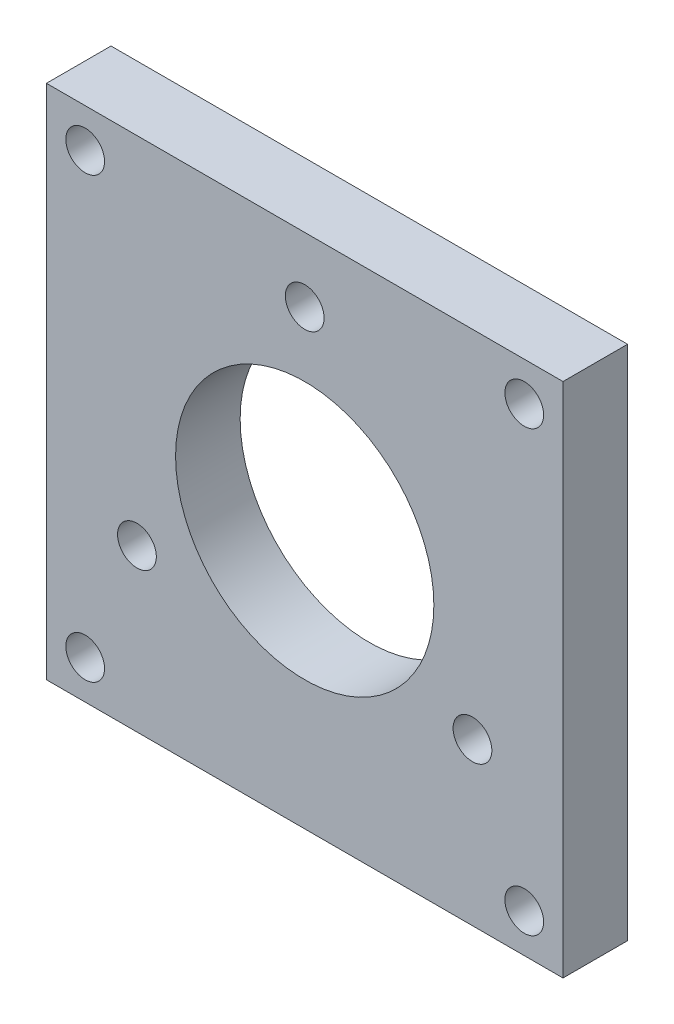
ISO-10303-21;
HEADER;
FILE_DESCRIPTION(('STEP AP214'),'2;1');
FILE_NAME('part.step','',(''),(''),'','','');
FILE_SCHEMA(('AUTOMOTIVE_DESIGN { 1 0 10303 214 1 1 1 1 }'));
ENDSEC;
DATA;
#1=APPLICATION_CONTEXT('core data for automotive mechanical design processes');
#2=APPLICATION_PROTOCOL_DEFINITION('international standard','automotive_design',2000,#1);
#3=PRODUCT_CONTEXT('',#1,'mechanical');
#4=PRODUCT('Part','Part','',(#3));
#5=PRODUCT_RELATED_PRODUCT_CATEGORY('part','',(#4));
#6=PRODUCT_DEFINITION_FORMATION('','',#4);
#7=PRODUCT_DEFINITION_CONTEXT('part definition',#1,'design');
#8=PRODUCT_DEFINITION('design','',#6,#7);
#9=PRODUCT_DEFINITION_SHAPE('','',#8);
#10=(LENGTH_UNIT() NAMED_UNIT(*) SI_UNIT(.MILLI.,.METRE.));
#11=(NAMED_UNIT(*) PLANE_ANGLE_UNIT() SI_UNIT($,.RADIAN.));
#12=(NAMED_UNIT(*) SI_UNIT($,.STERADIAN.) SOLID_ANGLE_UNIT());
#13=UNCERTAINTY_MEASURE_WITH_UNIT(LENGTH_MEASURE(1.E-05),#10,'distance_accuracy_value','');
#14=(GEOMETRIC_REPRESENTATION_CONTEXT(3) GLOBAL_UNCERTAINTY_ASSIGNED_CONTEXT((#13)) GLOBAL_UNIT_ASSIGNED_CONTEXT((#10,
#11,#12)) REPRESENTATION_CONTEXT('',''));
#15=CARTESIAN_POINT('',(0.,0.,0.));
#16=DIRECTION('',(0.,0.,1.));
#17=DIRECTION('',(1.,0.,0.));
#18=AXIS2_PLACEMENT_3D('',#15,#16,#17);
#19=CARTESIAN_POINT('',(20.,-20.,5.));
#20=DIRECTION('',(-1.,0.,0.));
#21=DIRECTION('',(0.,0.,1.));
#22=AXIS2_PLACEMENT_3D('',#19,#20,#21);
#23=PLANE('',#22);
#24=DIRECTION('',(0.,1.,0.));
#25=VECTOR('',#24,1.);
#26=CARTESIAN_POINT('',(20.,-20.,0.));
#27=LINE('',#26,#25);
#28=CARTESIAN_POINT('',(20.,-20.,0.));
#29=VERTEX_POINT('',#28);
#30=CARTESIAN_POINT('',(20.,20.,0.));
#31=VERTEX_POINT('',#30);
#32=EDGE_CURVE('E99',#29,#31,#27,.T.);
#33=ORIENTED_EDGE('',*,*,#32,.T.);
#34=DIRECTION('',(0.,0.,-1.));
#35=VECTOR('',#34,1.);
#36=CARTESIAN_POINT('',(20.,20.,5.));
#37=LINE('',#36,#35);
#38=CARTESIAN_POINT('',(20.,20.,5.));
#39=VERTEX_POINT('',#38);
#40=EDGE_CURVE('E11',#39,#31,#37,.T.);
#41=ORIENTED_EDGE('',*,*,#40,.F.);
#42=DIRECTION('',(0.,1.,0.));
#43=VECTOR('',#42,1.);
#44=CARTESIAN_POINT('',(20.,-20.,5.));
#45=LINE('',#44,#43);
#46=CARTESIAN_POINT('',(20.,-20.,5.));
#47=VERTEX_POINT('',#46);
#48=EDGE_CURVE('E87',#47,#39,#45,.T.);
#49=ORIENTED_EDGE('',*,*,#48,.F.);
#50=DIRECTION('',(0.,0.,-1.));
#51=VECTOR('',#50,1.);
#52=CARTESIAN_POINT('',(20.,-20.,5.));
#53=LINE('',#52,#51);
#54=EDGE_CURVE('E95',#47,#29,#53,.T.);
#55=ORIENTED_EDGE('',*,*,#54,.T.);
#56=EDGE_LOOP('',(#33,#41,#49,#55));
#57=FACE_BOUND('',#56,.T.);
#58=ADVANCED_FACE('F36',(#57),#23,.F.);
#59=CARTESIAN_POINT('',(-20.,20.,5.));
#60=DIRECTION('',(0.,-1.,0.));
#61=DIRECTION('',(1.,0.,0.));
#62=AXIS2_PLACEMENT_3D('',#59,#60,#61);
#63=PLANE('',#62);
#64=DIRECTION('',(-1.,0.,0.));
#65=VECTOR('',#64,1.);
#66=CARTESIAN_POINT('',(-20.,20.,0.));
#67=LINE('',#66,#65);
#68=CARTESIAN_POINT('',(-20.,20.,0.));
#69=VERTEX_POINT('',#68);
#70=EDGE_CURVE('E91',#31,#69,#67,.T.);
#71=ORIENTED_EDGE('',*,*,#70,.T.);
#72=DIRECTION('',(0.,0.,-1.));
#73=VECTOR('',#72,1.);
#74=CARTESIAN_POINT('',(-20.,20.,5.));
#75=LINE('',#74,#73);
#76=CARTESIAN_POINT('',(-20.,20.,5.));
#77=VERTEX_POINT('',#76);
#78=EDGE_CURVE('E44',#77,#69,#75,.T.);
#79=ORIENTED_EDGE('',*,*,#78,.F.);
#80=DIRECTION('',(-1.,0.,0.));
#81=VECTOR('',#80,1.);
#82=CARTESIAN_POINT('',(-20.,20.,5.));
#83=LINE('',#82,#81);
#84=EDGE_CURVE('E82',#39,#77,#83,.T.);
#85=ORIENTED_EDGE('',*,*,#84,.F.);
#86=ORIENTED_EDGE('',*,*,#40,.T.);
#87=EDGE_LOOP('',(#71,#79,#85,#86));
#88=FACE_BOUND('',#87,.T.);
#89=ADVANCED_FACE('F90',(#88),#63,.F.);
#90=CARTESIAN_POINT('',(-20.,-20.,5.));
#91=DIRECTION('',(1.,0.,0.));
#92=DIRECTION('',(0.,1.,0.));
#93=AXIS2_PLACEMENT_3D('',#90,#91,#92);
#94=PLANE('',#93);
#95=DIRECTION('',(0.,-1.,0.));
#96=VECTOR('',#95,1.);
#97=CARTESIAN_POINT('',(-20.,-20.,0.));
#98=LINE('',#97,#96);
#99=CARTESIAN_POINT('',(-20.,-20.,0.));
#100=VERTEX_POINT('',#99);
#101=EDGE_CURVE('E69',#69,#100,#98,.T.);
#102=ORIENTED_EDGE('',*,*,#101,.T.);
#103=DIRECTION('',(0.,0.,-1.));
#104=VECTOR('',#103,1.);
#105=CARTESIAN_POINT('',(-20.,-20.,5.));
#106=LINE('',#105,#104);
#107=CARTESIAN_POINT('',(-20.,-20.,5.));
#108=VERTEX_POINT('',#107);
#109=EDGE_CURVE('E92',#108,#100,#106,.T.);
#110=ORIENTED_EDGE('',*,*,#109,.F.);
#111=DIRECTION('',(0.,-1.,0.));
#112=VECTOR('',#111,1.);
#113=CARTESIAN_POINT('',(-20.,-20.,5.));
#114=LINE('',#113,#112);
#115=EDGE_CURVE('E85',#77,#108,#114,.T.);
#116=ORIENTED_EDGE('',*,*,#115,.F.);
#117=ORIENTED_EDGE('',*,*,#78,.T.);
#118=EDGE_LOOP('',(#102,#110,#116,#117));
#119=FACE_BOUND('',#118,.T.);
#120=ADVANCED_FACE('F93',(#119),#94,.F.);
#121=CARTESIAN_POINT('',(-20.,-20.,5.));
#122=DIRECTION('',(0.,1.,0.));
#123=DIRECTION('',(0.,0.,1.));
#124=AXIS2_PLACEMENT_3D('',#121,#122,#123);
#125=PLANE('',#124);
#126=DIRECTION('',(1.,0.,0.));
#127=VECTOR('',#126,1.);
#128=CARTESIAN_POINT('',(-20.,-20.,0.));
#129=LINE('',#128,#127);
#130=EDGE_CURVE('E75',#100,#29,#129,.T.);
#131=ORIENTED_EDGE('',*,*,#130,.T.);
#132=ORIENTED_EDGE('',*,*,#54,.F.);
#133=DIRECTION('',(1.,0.,0.));
#134=VECTOR('',#133,1.);
#135=CARTESIAN_POINT('',(-20.,-20.,5.));
#136=LINE('',#135,#134);
#137=EDGE_CURVE('E52',#108,#47,#136,.T.);
#138=ORIENTED_EDGE('',*,*,#137,.F.);
#139=ORIENTED_EDGE('',*,*,#109,.T.);
#140=EDGE_LOOP('',(#131,#132,#138,#139));
#141=FACE_BOUND('',#140,.T.);
#142=ADVANCED_FACE('F107',(#141),#125,.F.);
#143=CARTESIAN_POINT('',(0.,0.,5.));
#144=DIRECTION('',(0.,0.,-1.));
#145=DIRECTION('',(-1.,0.,0.));
#146=AXIS2_PLACEMENT_3D('',#143,#144,#145);
#147=PLANE('',#146);
#148=CARTESIAN_POINT('',(17.,-17.,5.));
#149=DIRECTION('',(0.,0.,-1.));
#150=DIRECTION('',(1.,0.,0.));
#151=AXIS2_PLACEMENT_3D('',#148,#149,#150);
#152=CIRCLE('',#151,1.5);
#153=CARTESIAN_POINT('',(18.5,-17.,5.));
#154=VERTEX_POINT('',#153);
#155=EDGE_CURVE('E143',#154,#154,#152,.T.);
#156=ORIENTED_EDGE('',*,*,#155,.T.);
#157=EDGE_LOOP('',(#156));
#158=FACE_BOUND('',#157,.T.);
#159=CARTESIAN_POINT('',(-17.,-17.,5.));
#160=DIRECTION('',(0.,0.,-1.));
#161=DIRECTION('',(-1.,0.,0.));
#162=AXIS2_PLACEMENT_3D('',#159,#160,#161);
#163=CIRCLE('',#162,1.5);
#164=CARTESIAN_POINT('',(-18.5,-17.,5.));
#165=VERTEX_POINT('',#164);
#166=EDGE_CURVE('E149',#165,#165,#163,.T.);
#167=ORIENTED_EDGE('',*,*,#166,.T.);
#168=EDGE_LOOP('',(#167));
#169=FACE_BOUND('',#168,.T.);
#170=CARTESIAN_POINT('',(-17.,17.,5.));
#171=DIRECTION('',(0.,0.,-1.));
#172=DIRECTION('',(1.,0.,0.));
#173=AXIS2_PLACEMENT_3D('',#170,#171,#172);
#174=CIRCLE('',#173,1.5);
#175=CARTESIAN_POINT('',(-15.5,17.,5.));
#176=VERTEX_POINT('',#175);
#177=EDGE_CURVE('E155',#176,#176,#174,.T.);
#178=ORIENTED_EDGE('',*,*,#177,.T.);
#179=EDGE_LOOP('',(#178));
#180=FACE_BOUND('',#179,.T.);
#181=CARTESIAN_POINT('',(17.,17.,5.));
#182=DIRECTION('',(0.,0.,-1.));
#183=DIRECTION('',(-1.,0.,0.));
#184=AXIS2_PLACEMENT_3D('',#181,#182,#183);
#185=CIRCLE('',#184,1.5);
#186=CARTESIAN_POINT('',(15.5,17.,5.));
#187=VERTEX_POINT('',#186);
#188=EDGE_CURVE('E123',#187,#187,#185,.T.);
#189=ORIENTED_EDGE('',*,*,#188,.T.);
#190=EDGE_LOOP('',(#189));
#191=FACE_BOUND('',#190,.T.);
#192=CARTESIAN_POINT('',(0.,15.,5.));
#193=DIRECTION('',(0.,0.,-1.));
#194=DIRECTION('',(-1.,0.,0.));
#195=AXIS2_PLACEMENT_3D('',#192,#193,#194);
#196=CIRCLE('',#195,1.5);
#197=CARTESIAN_POINT('',(-1.5,15.,5.));
#198=VERTEX_POINT('',#197);
#199=EDGE_CURVE('E116',#198,#198,#196,.T.);
#200=ORIENTED_EDGE('',*,*,#199,.T.);
#201=EDGE_LOOP('',(#200));
#202=FACE_BOUND('',#201,.T.);
#203=CARTESIAN_POINT('',(-12.9903810567672,-7.49999999999963,5.));
#204=DIRECTION('',(0.,0.,-1.));
#205=DIRECTION('',(-1.,0.,0.));
#206=AXIS2_PLACEMENT_3D('',#203,#204,#205);
#207=CIRCLE('',#206,1.50000000000057);
#208=CARTESIAN_POINT('',(-14.4903810567678,-7.49999999999963,5.));
#209=VERTEX_POINT('',#208);
#210=EDGE_CURVE('E126',#209,#209,#207,.T.);
#211=ORIENTED_EDGE('',*,*,#210,.T.);
#212=EDGE_LOOP('',(#211));
#213=FACE_BOUND('',#212,.T.);
#214=CARTESIAN_POINT('',(12.9903810567659,-7.50000000000036,5.));
#215=DIRECTION('',(0.,0.,-1.));
#216=DIRECTION('',(-1.,0.,0.));
#217=AXIS2_PLACEMENT_3D('',#214,#215,#216);
#218=CIRCLE('',#217,1.50000000000084);
#219=CARTESIAN_POINT('',(11.4903810567651,-7.50000000000036,5.));
#220=VERTEX_POINT('',#219);
#221=EDGE_CURVE('E119',#220,#220,#218,.T.);
#222=ORIENTED_EDGE('',*,*,#221,.T.);
#223=EDGE_LOOP('',(#222));
#224=FACE_BOUND('',#223,.T.);
#225=CARTESIAN_POINT('',(0.,0.,5.));
#226=DIRECTION('',(0.,0.,-1.));
#227=DIRECTION('',(-1.,0.,0.));
#228=AXIS2_PLACEMENT_3D('',#225,#226,#227);
#229=CIRCLE('',#228,10.);
#230=CARTESIAN_POINT('',(-10.,0.,5.));
#231=VERTEX_POINT('',#230);
#232=EDGE_CURVE('E102',#231,#231,#229,.T.);
#233=ORIENTED_EDGE('',*,*,#232,.T.);
#234=EDGE_LOOP('',(#233));
#235=FACE_BOUND('',#234,.T.);
#236=ORIENTED_EDGE('',*,*,#48,.T.);
#237=ORIENTED_EDGE('',*,*,#84,.T.);
#238=ORIENTED_EDGE('',*,*,#115,.T.);
#239=ORIENTED_EDGE('',*,*,#137,.T.);
#240=EDGE_LOOP('',(#236,#237,#238,#239));
#241=FACE_BOUND('',#240,.T.);
#242=ADVANCED_FACE('F83',(#158,#169,#180,#191,#202,#213,#224,#235,#241),#147,.F.);
#243=CARTESIAN_POINT('',(0.,0.,0.));
#244=DIRECTION('',(0.,0.,-1.));
#245=DIRECTION('',(-1.,0.,0.));
#246=AXIS2_PLACEMENT_3D('',#243,#244,#245);
#247=PLANE('',#246);
#248=CARTESIAN_POINT('',(17.,-17.,0.));
#249=DIRECTION('',(0.,0.,-1.));
#250=DIRECTION('',(1.,0.,0.));
#251=AXIS2_PLACEMENT_3D('',#248,#249,#250);
#252=CIRCLE('',#251,1.5);
#253=CARTESIAN_POINT('',(18.5,-17.,0.));
#254=VERTEX_POINT('',#253);
#255=EDGE_CURVE('E146',#254,#254,#252,.T.);
#256=ORIENTED_EDGE('',*,*,#255,.F.);
#257=EDGE_LOOP('',(#256));
#258=FACE_BOUND('',#257,.T.);
#259=CARTESIAN_POINT('',(-17.,-17.,0.));
#260=DIRECTION('',(0.,0.,-1.));
#261=DIRECTION('',(-1.,0.,0.));
#262=AXIS2_PLACEMENT_3D('',#259,#260,#261);
#263=CIRCLE('',#262,1.5);
#264=CARTESIAN_POINT('',(-18.5,-17.,0.));
#265=VERTEX_POINT('',#264);
#266=EDGE_CURVE('E152',#265,#265,#263,.T.);
#267=ORIENTED_EDGE('',*,*,#266,.F.);
#268=EDGE_LOOP('',(#267));
#269=FACE_BOUND('',#268,.T.);
#270=CARTESIAN_POINT('',(-17.,17.,0.));
#271=DIRECTION('',(0.,0.,-1.));
#272=DIRECTION('',(1.,0.,0.));
#273=AXIS2_PLACEMENT_3D('',#270,#271,#272);
#274=CIRCLE('',#273,1.5);
#275=CARTESIAN_POINT('',(-15.5,17.,0.));
#276=VERTEX_POINT('',#275);
#277=EDGE_CURVE('E140',#276,#276,#274,.T.);
#278=ORIENTED_EDGE('',*,*,#277,.F.);
#279=EDGE_LOOP('',(#278));
#280=FACE_BOUND('',#279,.T.);
#281=CARTESIAN_POINT('',(17.,17.,0.));
#282=DIRECTION('',(0.,0.,-1.));
#283=DIRECTION('',(-1.,0.,0.));
#284=AXIS2_PLACEMENT_3D('',#281,#282,#283);
#285=CIRCLE('',#284,1.5);
#286=CARTESIAN_POINT('',(15.5,17.,0.));
#287=VERTEX_POINT('',#286);
#288=EDGE_CURVE('E137',#287,#287,#285,.T.);
#289=ORIENTED_EDGE('',*,*,#288,.F.);
#290=EDGE_LOOP('',(#289));
#291=FACE_BOUND('',#290,.T.);
#292=CARTESIAN_POINT('',(0.,15.,0.));
#293=DIRECTION('',(0.,0.,-1.));
#294=DIRECTION('',(-1.,0.,0.));
#295=AXIS2_PLACEMENT_3D('',#292,#293,#294);
#296=CIRCLE('',#295,1.5);
#297=CARTESIAN_POINT('',(-1.5,15.,0.));
#298=VERTEX_POINT('',#297);
#299=EDGE_CURVE('E132',#298,#298,#296,.T.);
#300=ORIENTED_EDGE('',*,*,#299,.F.);
#301=EDGE_LOOP('',(#300));
#302=FACE_BOUND('',#301,.T.);
#303=CARTESIAN_POINT('',(-12.9903810567672,-7.49999999999963,0.));
#304=DIRECTION('',(0.,0.,-1.));
#305=DIRECTION('',(-1.,0.,0.));
#306=AXIS2_PLACEMENT_3D('',#303,#304,#305);
#307=CIRCLE('',#306,1.50000000000057);
#308=CARTESIAN_POINT('',(-14.4903810567678,-7.49999999999963,0.));
#309=VERTEX_POINT('',#308);
#310=EDGE_CURVE('E129',#309,#309,#307,.T.);
#311=ORIENTED_EDGE('',*,*,#310,.F.);
#312=EDGE_LOOP('',(#311));
#313=FACE_BOUND('',#312,.T.);
#314=CARTESIAN_POINT('',(12.9903810567659,-7.50000000000036,0.));
#315=DIRECTION('',(0.,0.,-1.));
#316=DIRECTION('',(-1.,0.,0.));
#317=AXIS2_PLACEMENT_3D('',#314,#315,#316);
#318=CIRCLE('',#317,1.50000000000084);
#319=CARTESIAN_POINT('',(11.4903810567651,-7.50000000000036,0.));
#320=VERTEX_POINT('',#319);
#321=EDGE_CURVE('E122',#320,#320,#318,.T.);
#322=ORIENTED_EDGE('',*,*,#321,.F.);
#323=EDGE_LOOP('',(#322));
#324=FACE_BOUND('',#323,.T.);
#325=CARTESIAN_POINT('',(0.,0.,0.));
#326=DIRECTION('',(0.,0.,-1.));
#327=DIRECTION('',(-1.,0.,0.));
#328=AXIS2_PLACEMENT_3D('',#325,#326,#327);
#329=CIRCLE('',#328,10.);
#330=CARTESIAN_POINT('',(-10.,0.,0.));
#331=VERTEX_POINT('',#330);
#332=EDGE_CURVE('E113',#331,#331,#329,.T.);
#333=ORIENTED_EDGE('',*,*,#332,.F.);
#334=EDGE_LOOP('',(#333));
#335=FACE_BOUND('',#334,.T.);
#336=ORIENTED_EDGE('',*,*,#32,.F.);
#337=ORIENTED_EDGE('',*,*,#130,.F.);
#338=ORIENTED_EDGE('',*,*,#101,.F.);
#339=ORIENTED_EDGE('',*,*,#70,.F.);
#340=EDGE_LOOP('',(#336,#337,#338,#339));
#341=FACE_BOUND('',#340,.T.);
#342=ADVANCED_FACE('F110',(#258,#269,#280,#291,#302,#313,#324,#335,#341),#247,.T.);
#343=CARTESIAN_POINT('',(0.,0.,5.));
#344=DIRECTION('',(0.,0.,-1.));
#345=DIRECTION('',(-1.,0.,0.));
#346=AXIS2_PLACEMENT_3D('',#343,#344,#345);
#347=CYLINDRICAL_SURFACE('',#346,10.);
#348=ORIENTED_EDGE('',*,*,#232,.F.);
#349=EDGE_LOOP('',(#348));
#350=FACE_BOUND('',#349,.T.);
#351=ORIENTED_EDGE('',*,*,#332,.T.);
#352=EDGE_LOOP('',(#351));
#353=FACE_BOUND('',#352,.T.);
#354=ADVANCED_FACE('F165',(#350,#353),#347,.F.);
#355=CARTESIAN_POINT('',(12.9903810567659,-7.50000000000036,5.));
#356=DIRECTION('',(0.,0.,-1.));
#357=DIRECTION('',(-1.,0.,0.));
#358=AXIS2_PLACEMENT_3D('',#355,#356,#357);
#359=CYLINDRICAL_SURFACE('',#358,1.50000000000084);
#360=ORIENTED_EDGE('',*,*,#221,.F.);
#361=EDGE_LOOP('',(#360));
#362=FACE_BOUND('',#361,.T.);
#363=ORIENTED_EDGE('',*,*,#321,.T.);
#364=EDGE_LOOP('',(#363));
#365=FACE_BOUND('',#364,.T.);
#366=ADVANCED_FACE('F179',(#362,#365),#359,.F.);
#367=CARTESIAN_POINT('',(-12.9903810567672,-7.49999999999963,5.));
#368=DIRECTION('',(0.,0.,-1.));
#369=DIRECTION('',(-1.,0.,0.));
#370=AXIS2_PLACEMENT_3D('',#367,#368,#369);
#371=CYLINDRICAL_SURFACE('',#370,1.50000000000057);
#372=ORIENTED_EDGE('',*,*,#210,.F.);
#373=EDGE_LOOP('',(#372));
#374=FACE_BOUND('',#373,.T.);
#375=ORIENTED_EDGE('',*,*,#310,.T.);
#376=EDGE_LOOP('',(#375));
#377=FACE_BOUND('',#376,.T.);
#378=ADVANCED_FACE('F185',(#374,#377),#371,.F.);
#379=CARTESIAN_POINT('',(0.,15.,5.));
#380=DIRECTION('',(0.,0.,-1.));
#381=DIRECTION('',(-1.,0.,0.));
#382=AXIS2_PLACEMENT_3D('',#379,#380,#381);
#383=CYLINDRICAL_SURFACE('',#382,1.5);
#384=ORIENTED_EDGE('',*,*,#199,.F.);
#385=EDGE_LOOP('',(#384));
#386=FACE_BOUND('',#385,.T.);
#387=ORIENTED_EDGE('',*,*,#299,.T.);
#388=EDGE_LOOP('',(#387));
#389=FACE_BOUND('',#388,.T.);
#390=ADVANCED_FACE('F222',(#386,#389),#383,.F.);
#391=CARTESIAN_POINT('',(17.,17.,5.));
#392=DIRECTION('',(0.,0.,-1.));
#393=DIRECTION('',(-1.,0.,0.));
#394=AXIS2_PLACEMENT_3D('',#391,#392,#393);
#395=CYLINDRICAL_SURFACE('',#394,1.5);
#396=ORIENTED_EDGE('',*,*,#188,.F.);
#397=EDGE_LOOP('',(#396));
#398=FACE_BOUND('',#397,.T.);
#399=ORIENTED_EDGE('',*,*,#288,.T.);
#400=EDGE_LOOP('',(#399));
#401=FACE_BOUND('',#400,.T.);
#402=ADVANCED_FACE('F227',(#398,#401),#395,.F.);
#403=CARTESIAN_POINT('',(-17.,17.,5.));
#404=DIRECTION('',(0.,0.,-1.));
#405=DIRECTION('',(-1.,0.,0.));
#406=AXIS2_PLACEMENT_3D('',#403,#404,#405);
#407=CYLINDRICAL_SURFACE('',#406,1.5);
#408=ORIENTED_EDGE('',*,*,#177,.F.);
#409=EDGE_LOOP('',(#408));
#410=FACE_BOUND('',#409,.T.);
#411=ORIENTED_EDGE('',*,*,#277,.T.);
#412=EDGE_LOOP('',(#411));
#413=FACE_BOUND('',#412,.T.);
#414=ADVANCED_FACE('F161',(#410,#413),#407,.F.);
#415=CARTESIAN_POINT('',(-17.,-17.,5.));
#416=DIRECTION('',(0.,0.,-1.));
#417=DIRECTION('',(-1.,0.,0.));
#418=AXIS2_PLACEMENT_3D('',#415,#416,#417);
#419=CYLINDRICAL_SURFACE('',#418,1.5);
#420=ORIENTED_EDGE('',*,*,#166,.F.);
#421=EDGE_LOOP('',(#420));
#422=FACE_BOUND('',#421,.T.);
#423=ORIENTED_EDGE('',*,*,#266,.T.);
#424=EDGE_LOOP('',(#423));
#425=FACE_BOUND('',#424,.T.);
#426=ADVANCED_FACE('F237',(#422,#425),#419,.F.);
#427=CARTESIAN_POINT('',(17.,-17.,5.));
#428=DIRECTION('',(0.,0.,-1.));
#429=DIRECTION('',(-1.,0.,0.));
#430=AXIS2_PLACEMENT_3D('',#427,#428,#429);
#431=CYLINDRICAL_SURFACE('',#430,1.5);
#432=ORIENTED_EDGE('',*,*,#155,.F.);
#433=EDGE_LOOP('',(#432));
#434=FACE_BOUND('',#433,.T.);
#435=ORIENTED_EDGE('',*,*,#255,.T.);
#436=EDGE_LOOP('',(#435));
#437=FACE_BOUND('',#436,.T.);
#438=ADVANCED_FACE('F234',(#434,#437),#431,.F.);
#439=CLOSED_SHELL('',(#58,#89,#120,#142,#242,#342,#354,#366,#378,#390,#402,#414,#426,#438));
#440=MANIFOLD_SOLID_BREP('B2',#439);
#441=ADVANCED_BREP_SHAPE_REPRESENTATION('',(#18,#440),#14);
#442=SHAPE_DEFINITION_REPRESENTATION(#9,#441);
ENDSEC;
END-ISO-10303-21;
